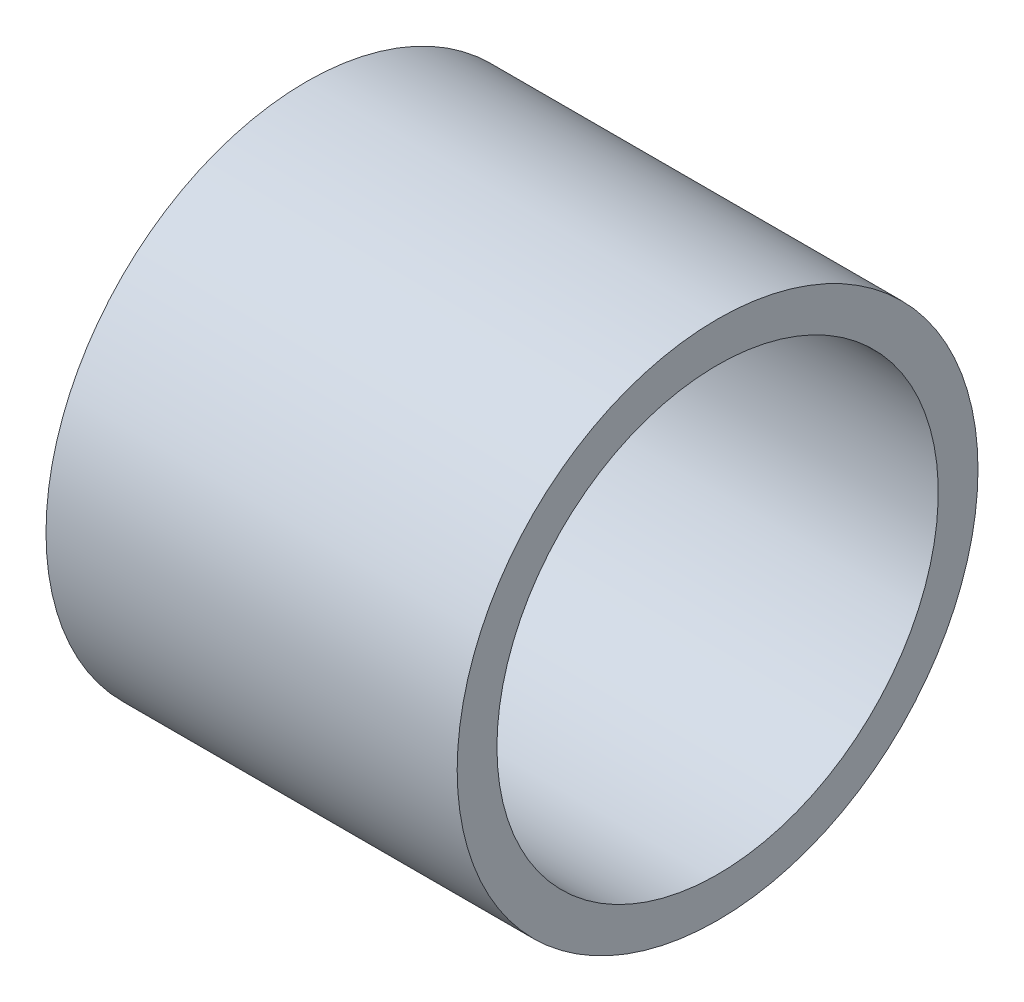
ISO-10303-21;
HEADER;
FILE_DESCRIPTION(('STEP AP214'),'2;1');
FILE_NAME('part.step','',(''),(''),'','','');
FILE_SCHEMA(('AUTOMOTIVE_DESIGN { 1 0 10303 214 1 1 1 1 }'));
ENDSEC;
DATA;
#1=APPLICATION_CONTEXT('core data for automotive mechanical design processes');
#2=APPLICATION_PROTOCOL_DEFINITION('international standard','automotive_design',2000,#1);
#3=PRODUCT_CONTEXT('',#1,'mechanical');
#4=PRODUCT('Part','Part','',(#3));
#5=PRODUCT_RELATED_PRODUCT_CATEGORY('part','',(#4));
#6=PRODUCT_DEFINITION_FORMATION('','',#4);
#7=PRODUCT_DEFINITION_CONTEXT('part definition',#1,'design');
#8=PRODUCT_DEFINITION('design','',#6,#7);
#9=PRODUCT_DEFINITION_SHAPE('','',#8);
#10=(LENGTH_UNIT() NAMED_UNIT(*) SI_UNIT(.MILLI.,.METRE.));
#11=(NAMED_UNIT(*) PLANE_ANGLE_UNIT() SI_UNIT($,.RADIAN.));
#12=(NAMED_UNIT(*) SI_UNIT($,.STERADIAN.) SOLID_ANGLE_UNIT());
#13=UNCERTAINTY_MEASURE_WITH_UNIT(LENGTH_MEASURE(1.E-05),#10,'distance_accuracy_value','');
#14=(GEOMETRIC_REPRESENTATION_CONTEXT(3) GLOBAL_UNCERTAINTY_ASSIGNED_CONTEXT((#13)) GLOBAL_UNIT_ASSIGNED_CONTEXT((#10,
#11,#12)) REPRESENTATION_CONTEXT('',''));
#15=CARTESIAN_POINT('',(0.,0.,0.));
#16=DIRECTION('',(0.,0.,1.));
#17=DIRECTION('',(1.,0.,0.));
#18=AXIS2_PLACEMENT_3D('',#15,#16,#17);
#19=CARTESIAN_POINT('',(38.1,0.,0.));
#20=DIRECTION('',(1.,0.,0.));
#21=DIRECTION('',(0.,0.,-1.));
#22=AXIS2_PLACEMENT_3D('',#19,#20,#21);
#23=PLANE('',#22);
#24=CARTESIAN_POINT('',(38.1,0.,0.));
#25=DIRECTION('',(1.,0.,0.));
#26=DIRECTION('',(0.,0.,-1.));
#27=AXIS2_PLACEMENT_3D('',#24,#25,#26);
#28=CIRCLE('',#27,24.13);
#29=CARTESIAN_POINT('',(38.1,0.,24.13));
#30=VERTEX_POINT('',#29);
#31=EDGE_CURVE('E10',#30,#30,#28,.T.);
#32=ORIENTED_EDGE('',*,*,#31,.T.);
#33=EDGE_LOOP('',(#32));
#34=FACE_BOUND('',#33,.T.);
#35=CARTESIAN_POINT('',(38.1,0.,0.));
#36=DIRECTION('',(1.,0.,0.));
#37=DIRECTION('',(0.,0.,-1.));
#38=AXIS2_PLACEMENT_3D('',#35,#36,#37);
#39=CIRCLE('',#38,20.447);
#40=CARTESIAN_POINT('',(38.1,0.,20.447));
#41=VERTEX_POINT('',#40);
#42=EDGE_CURVE('E41',#41,#41,#39,.T.);
#43=ORIENTED_EDGE('',*,*,#42,.F.);
#44=EDGE_LOOP('',(#43));
#45=FACE_BOUND('',#44,.T.);
#46=ADVANCED_FACE('F30',(#34,#45),#23,.T.);
#47=CARTESIAN_POINT('',(0.,0.,0.));
#48=DIRECTION('',(1.,0.,0.));
#49=DIRECTION('',(0.,0.,-1.));
#50=AXIS2_PLACEMENT_3D('',#47,#48,#49);
#51=PLANE('',#50);
#52=CARTESIAN_POINT('',(0.,0.,0.));
#53=DIRECTION('',(1.,0.,0.));
#54=DIRECTION('',(0.,0.,-1.));
#55=AXIS2_PLACEMENT_3D('',#52,#53,#54);
#56=CIRCLE('',#55,24.13);
#57=CARTESIAN_POINT('',(0.,0.,24.13));
#58=VERTEX_POINT('',#57);
#59=EDGE_CURVE('E34',#58,#58,#56,.T.);
#60=ORIENTED_EDGE('',*,*,#59,.F.);
#61=EDGE_LOOP('',(#60));
#62=FACE_BOUND('',#61,.T.);
#63=CARTESIAN_POINT('',(0.,0.,0.));
#64=DIRECTION('',(1.,0.,0.));
#65=DIRECTION('',(0.,0.,-1.));
#66=AXIS2_PLACEMENT_3D('',#63,#64,#65);
#67=CIRCLE('',#66,20.447);
#68=CARTESIAN_POINT('',(0.,0.,20.447));
#69=VERTEX_POINT('',#68);
#70=EDGE_CURVE('E43',#69,#69,#67,.T.);
#71=ORIENTED_EDGE('',*,*,#70,.T.);
#72=EDGE_LOOP('',(#71));
#73=FACE_BOUND('',#72,.T.);
#74=ADVANCED_FACE('F53',(#62,#73),#51,.F.);
#75=CARTESIAN_POINT('',(38.1,0.,0.));
#76=DIRECTION('',(-1.,0.,0.));
#77=DIRECTION('',(0.,0.,1.));
#78=AXIS2_PLACEMENT_3D('',#75,#76,#77);
#79=CYLINDRICAL_SURFACE('',#78,24.13);
#80=CARTESIAN_POINT('',(38.1,0.,24.13));
#81=CARTESIAN_POINT('',(37.703125,0.,24.13));
#82=CARTESIAN_POINT('',(37.30625,0.,24.13));
#83=CARTESIAN_POINT('',(36.5125,0.,24.13));
#84=CARTESIAN_POINT('',(36.115625,0.,24.13));
#85=CARTESIAN_POINT('',(35.321875,0.,24.13));
#86=CARTESIAN_POINT('',(34.925,0.,24.13));
#87=CARTESIAN_POINT('',(34.13125,0.,24.13));
#88=CARTESIAN_POINT('',(33.734375,0.,24.13));
#89=CARTESIAN_POINT('',(32.940625,0.,24.13));
#90=CARTESIAN_POINT('',(32.54375,0.,24.13));
#91=CARTESIAN_POINT('',(31.75,0.,24.13));
#92=CARTESIAN_POINT('',(31.353125,0.,24.13));
#93=CARTESIAN_POINT('',(30.559375,0.,24.13));
#94=CARTESIAN_POINT('',(30.1625,0.,24.13));
#95=CARTESIAN_POINT('',(29.36875,0.,24.13));
#96=CARTESIAN_POINT('',(28.971875,0.,24.13));
#97=CARTESIAN_POINT('',(28.178125,0.,24.13));
#98=CARTESIAN_POINT('',(27.78125,0.,24.13));
#99=CARTESIAN_POINT('',(26.9875,0.,24.13));
#100=CARTESIAN_POINT('',(26.590625,0.,24.13));
#101=CARTESIAN_POINT('',(25.796875,0.,24.13));
#102=CARTESIAN_POINT('',(25.4,0.,24.13));
#103=CARTESIAN_POINT('',(24.60625,0.,24.13));
#104=CARTESIAN_POINT('',(24.209375,0.,24.13));
#105=CARTESIAN_POINT('',(23.415625,0.,24.13));
#106=CARTESIAN_POINT('',(23.01875,0.,24.13));
#107=CARTESIAN_POINT('',(22.225,0.,24.13));
#108=CARTESIAN_POINT('',(21.828125,0.,24.13));
#109=CARTESIAN_POINT('',(21.034375,0.,24.13));
#110=CARTESIAN_POINT('',(20.6375,0.,24.13));
#111=CARTESIAN_POINT('',(19.84375,0.,24.13));
#112=CARTESIAN_POINT('',(19.446875,0.,24.13));
#113=CARTESIAN_POINT('',(18.653125,0.,24.13));
#114=CARTESIAN_POINT('',(18.25625,0.,24.13));
#115=CARTESIAN_POINT('',(17.4625,0.,24.13));
#116=CARTESIAN_POINT('',(17.065625,0.,24.13));
#117=CARTESIAN_POINT('',(16.271875,0.,24.13));
#118=CARTESIAN_POINT('',(15.875,0.,24.13));
#119=CARTESIAN_POINT('',(15.08125,0.,24.13));
#120=CARTESIAN_POINT('',(14.684375,0.,24.13));
#121=CARTESIAN_POINT('',(13.890625,0.,24.13));
#122=CARTESIAN_POINT('',(13.49375,0.,24.13));
#123=CARTESIAN_POINT('',(12.7,0.,24.13));
#124=CARTESIAN_POINT('',(12.303125,0.,24.13));
#125=CARTESIAN_POINT('',(11.509375,0.,24.13));
#126=CARTESIAN_POINT('',(11.1125,0.,24.13));
#127=CARTESIAN_POINT('',(10.31875,0.,24.13));
#128=CARTESIAN_POINT('',(9.92187499999999,0.,24.13));
#129=CARTESIAN_POINT('',(9.128125,0.,24.13));
#130=CARTESIAN_POINT('',(8.73124999999999,0.,24.13));
#131=CARTESIAN_POINT('',(7.93749999999999,0.,24.13));
#132=CARTESIAN_POINT('',(7.54062499999999,0.,24.13));
#133=CARTESIAN_POINT('',(6.746875,0.,24.13));
#134=CARTESIAN_POINT('',(6.35,0.,24.13));
#135=CARTESIAN_POINT('',(5.55625,0.,24.13));
#136=CARTESIAN_POINT('',(5.159375,0.,24.13));
#137=CARTESIAN_POINT('',(4.365625,0.,24.13));
#138=CARTESIAN_POINT('',(3.96875,0.,24.13));
#139=CARTESIAN_POINT('',(3.175,0.,24.13));
#140=CARTESIAN_POINT('',(2.778125,0.,24.13));
#141=CARTESIAN_POINT('',(1.984375,0.,24.13));
#142=CARTESIAN_POINT('',(1.5875,0.,24.13));
#143=CARTESIAN_POINT('',(0.79375,0.,24.13));
#144=CARTESIAN_POINT('',(0.396875,0.,24.13));
#145=CARTESIAN_POINT('',(0.,0.,24.13));
#146=B_SPLINE_CURVE_WITH_KNOTS('',3,(#80,#81,#82,#83,#84,#85,#86,#87,#88,#89,#90,#91,#92,#93,
#94,#95,#96,#97,#98,#99,#100,#101,#102,#103,#104,#105,#106,#107,#108,#109,#110,#111,#112,#113,
#114,#115,#116,#117,#118,#119,#120,#121,#122,#123,#124,#125,#126,#127,#128,#129,#130,#131,#132,
#133,#134,#135,#136,#137,#138,#139,#140,#141,#142,#143,#144,#145),.UNSPECIFIED.,.F.,.F.,(4,2,2,
2,2,2,2,2,2,2,2,2,2,2,2,2,2,2,2,2,2,2,2,2,2,2,2,2,2,2,2,2,4),(0.,1.190625,2.38125,3.571875,
4.7625,5.953125,7.14375,8.334375,9.52500000000001,10.715625,11.90625,13.096875,14.2875,
15.478125,16.66875,17.859375,19.05,20.240625,21.43125,22.621875,23.8125,25.003125,26.19375,
27.384375,28.575,29.765625,30.95625,32.146875,33.3375,34.528125,35.71875,36.909375,38.1),.UNSPECIFIED.);
#147=EDGE_CURVE('BSEAM32',#30,#58,#146,.T.);
#148=ORIENTED_EDGE('',*,*,#31,.F.);
#149=ORIENTED_EDGE('',*,*,#59,.T.);
#150=ORIENTED_EDGE('',*,*,#147,.T.);
#151=ORIENTED_EDGE('',*,*,#147,.F.);
#152=EDGE_LOOP('',(#148,#150,#149,#151));
#153=FACE_BOUND('',#152,.T.);
#154=ADVANCED_FACE('F32',(#153),#79,.T.);
#155=CARTESIAN_POINT('',(38.1,0.,0.));
#156=DIRECTION('',(-1.,0.,0.));
#157=DIRECTION('',(0.,0.,1.));
#158=AXIS2_PLACEMENT_3D('',#155,#156,#157);
#159=CYLINDRICAL_SURFACE('',#158,20.447);
#160=CARTESIAN_POINT('',(38.1,0.,20.447));
#161=CARTESIAN_POINT('',(37.703125,0.,20.447));
#162=CARTESIAN_POINT('',(37.30625,0.,20.447));
#163=CARTESIAN_POINT('',(36.5125,0.,20.447));
#164=CARTESIAN_POINT('',(36.115625,0.,20.447));
#165=CARTESIAN_POINT('',(35.321875,0.,20.447));
#166=CARTESIAN_POINT('',(34.925,0.,20.447));
#167=CARTESIAN_POINT('',(34.13125,0.,20.447));
#168=CARTESIAN_POINT('',(33.734375,0.,20.447));
#169=CARTESIAN_POINT('',(32.940625,0.,20.447));
#170=CARTESIAN_POINT('',(32.54375,0.,20.447));
#171=CARTESIAN_POINT('',(31.75,0.,20.447));
#172=CARTESIAN_POINT('',(31.353125,0.,20.447));
#173=CARTESIAN_POINT('',(30.559375,0.,20.447));
#174=CARTESIAN_POINT('',(30.1625,0.,20.447));
#175=CARTESIAN_POINT('',(29.36875,0.,20.447));
#176=CARTESIAN_POINT('',(28.971875,0.,20.447));
#177=CARTESIAN_POINT('',(28.178125,0.,20.447));
#178=CARTESIAN_POINT('',(27.78125,0.,20.447));
#179=CARTESIAN_POINT('',(26.9875,0.,20.447));
#180=CARTESIAN_POINT('',(26.590625,0.,20.447));
#181=CARTESIAN_POINT('',(25.796875,0.,20.447));
#182=CARTESIAN_POINT('',(25.4,0.,20.447));
#183=CARTESIAN_POINT('',(24.60625,0.,20.447));
#184=CARTESIAN_POINT('',(24.209375,0.,20.447));
#185=CARTESIAN_POINT('',(23.415625,0.,20.447));
#186=CARTESIAN_POINT('',(23.01875,0.,20.447));
#187=CARTESIAN_POINT('',(22.225,0.,20.447));
#188=CARTESIAN_POINT('',(21.828125,0.,20.447));
#189=CARTESIAN_POINT('',(21.034375,0.,20.447));
#190=CARTESIAN_POINT('',(20.6375,0.,20.447));
#191=CARTESIAN_POINT('',(19.84375,0.,20.447));
#192=CARTESIAN_POINT('',(19.446875,0.,20.447));
#193=CARTESIAN_POINT('',(18.653125,0.,20.447));
#194=CARTESIAN_POINT('',(18.25625,0.,20.447));
#195=CARTESIAN_POINT('',(17.4625,0.,20.447));
#196=CARTESIAN_POINT('',(17.065625,0.,20.447));
#197=CARTESIAN_POINT('',(16.271875,0.,20.447));
#198=CARTESIAN_POINT('',(15.875,0.,20.447));
#199=CARTESIAN_POINT('',(15.08125,0.,20.447));
#200=CARTESIAN_POINT('',(14.684375,0.,20.447));
#201=CARTESIAN_POINT('',(13.890625,0.,20.447));
#202=CARTESIAN_POINT('',(13.49375,0.,20.447));
#203=CARTESIAN_POINT('',(12.7,0.,20.447));
#204=CARTESIAN_POINT('',(12.303125,0.,20.447));
#205=CARTESIAN_POINT('',(11.509375,0.,20.447));
#206=CARTESIAN_POINT('',(11.1125,0.,20.447));
#207=CARTESIAN_POINT('',(10.31875,0.,20.447));
#208=CARTESIAN_POINT('',(9.92187499999999,0.,20.447));
#209=CARTESIAN_POINT('',(9.128125,0.,20.447));
#210=CARTESIAN_POINT('',(8.73124999999999,0.,20.447));
#211=CARTESIAN_POINT('',(7.93749999999999,0.,20.447));
#212=CARTESIAN_POINT('',(7.54062499999999,0.,20.447));
#213=CARTESIAN_POINT('',(6.746875,0.,20.447));
#214=CARTESIAN_POINT('',(6.35,0.,20.447));
#215=CARTESIAN_POINT('',(5.55625,0.,20.447));
#216=CARTESIAN_POINT('',(5.159375,0.,20.447));
#217=CARTESIAN_POINT('',(4.365625,0.,20.447));
#218=CARTESIAN_POINT('',(3.96875,0.,20.447));
#219=CARTESIAN_POINT('',(3.175,0.,20.447));
#220=CARTESIAN_POINT('',(2.778125,0.,20.447));
#221=CARTESIAN_POINT('',(1.984375,0.,20.447));
#222=CARTESIAN_POINT('',(1.5875,0.,20.447));
#223=CARTESIAN_POINT('',(0.79375,0.,20.447));
#224=CARTESIAN_POINT('',(0.396875,0.,20.447));
#225=CARTESIAN_POINT('',(0.,0.,20.447));
#226=B_SPLINE_CURVE_WITH_KNOTS('',3,(#160,#161,#162,#163,#164,#165,#166,#167,#168,#169,#170,
#171,#172,#173,#174,#175,#176,#177,#178,#179,#180,#181,#182,#183,#184,#185,#186,#187,#188,#189,
#190,#191,#192,#193,#194,#195,#196,#197,#198,#199,#200,#201,#202,#203,#204,#205,#206,#207,#208,
#209,#210,#211,#212,#213,#214,#215,#216,#217,#218,#219,#220,#221,#222,#223,#224,#225),
.UNSPECIFIED.,.F.,.F.,(4,2,2,2,2,2,2,2,2,2,2,2,2,2,2,2,2,2,2,2,2,2,2,2,2,2,2,2,2,2,2,2,4),(0.,
1.190625,2.38125,3.571875,4.7625,5.953125,7.14375,8.334375,9.52500000000001,10.715625,11.90625,
13.096875,14.2875,15.478125,16.66875,17.859375,19.05,20.240625,21.43125,22.621875,23.8125,
25.003125,26.19375,27.384375,28.575,29.765625,30.95625,32.146875,33.3375,34.528125,35.71875,
36.909375,38.1),.UNSPECIFIED.);
#227=EDGE_CURVE('BSEAM49',#41,#69,#226,.T.);
#228=ORIENTED_EDGE('',*,*,#42,.T.);
#229=ORIENTED_EDGE('',*,*,#70,.F.);
#230=ORIENTED_EDGE('',*,*,#227,.T.);
#231=ORIENTED_EDGE('',*,*,#227,.F.);
#232=EDGE_LOOP('',(#228,#230,#229,#231));
#233=FACE_BOUND('',#232,.T.);
#234=ADVANCED_FACE('F49',(#233),#159,.F.);
#235=CLOSED_SHELL('',(#46,#74,#154,#234));
#236=MANIFOLD_SOLID_BREP('B2',#235);
#237=ADVANCED_BREP_SHAPE_REPRESENTATION('',(#18,#236),#14);
#238=SHAPE_DEFINITION_REPRESENTATION(#9,#237);
ENDSEC;
END-ISO-10303-21;
